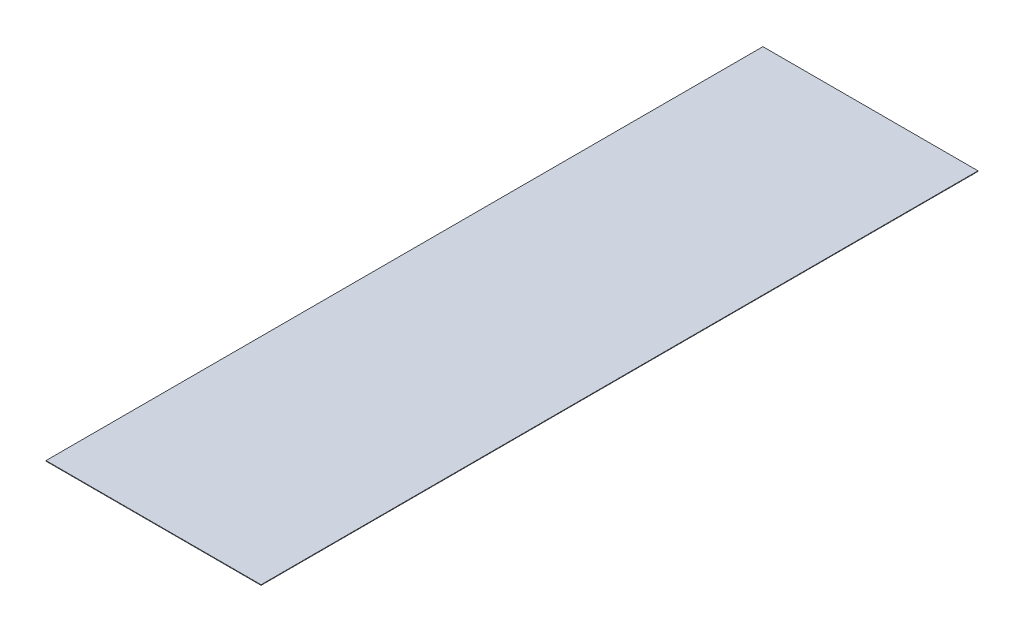
ISO-10303-21;
HEADER;
FILE_DESCRIPTION(('STEP AP214'),'2;1');
FILE_NAME('part.step','',(''),(''),'','','');
FILE_SCHEMA(('AUTOMOTIVE_DESIGN { 1 0 10303 214 1 1 1 1 }'));
ENDSEC;
DATA;
#1=APPLICATION_CONTEXT('core data for automotive mechanical design processes');
#2=APPLICATION_PROTOCOL_DEFINITION('international standard','automotive_design',2000,#1);
#3=PRODUCT_CONTEXT('',#1,'mechanical');
#4=PRODUCT('Part','Part','',(#3));
#5=PRODUCT_RELATED_PRODUCT_CATEGORY('part','',(#4));
#6=PRODUCT_DEFINITION_FORMATION('','',#4);
#7=PRODUCT_DEFINITION_CONTEXT('part definition',#1,'design');
#8=PRODUCT_DEFINITION('design','',#6,#7);
#9=PRODUCT_DEFINITION_SHAPE('','',#8);
#10=(LENGTH_UNIT() NAMED_UNIT(*) SI_UNIT(.MILLI.,.METRE.));
#11=(NAMED_UNIT(*) PLANE_ANGLE_UNIT() SI_UNIT($,.RADIAN.));
#12=(NAMED_UNIT(*) SI_UNIT($,.STERADIAN.) SOLID_ANGLE_UNIT());
#13=UNCERTAINTY_MEASURE_WITH_UNIT(LENGTH_MEASURE(1.E-05),#10,'distance_accuracy_value','');
#14=(GEOMETRIC_REPRESENTATION_CONTEXT(3) GLOBAL_UNCERTAINTY_ASSIGNED_CONTEXT((#13)) GLOBAL_UNIT_ASSIGNED_CONTEXT((#10,
#11,#12)) REPRESENTATION_CONTEXT('',''));
#15=CARTESIAN_POINT('',(0.,0.,0.));
#16=DIRECTION('',(0.,0.,1.));
#17=DIRECTION('',(1.,0.,0.));
#18=AXIS2_PLACEMENT_3D('',#15,#16,#17);
#19=CARTESIAN_POINT('',(457.2,2.3,1524.));
#20=DIRECTION('',(-1.,0.,0.));
#21=DIRECTION('',(0.,0.,1.));
#22=AXIS2_PLACEMENT_3D('',#19,#20,#21);
#23=PLANE('',#22);
#24=DIRECTION('',(0.,0.,-1.));
#25=VECTOR('',#24,1.);
#26=CARTESIAN_POINT('',(457.2,0.,1524.));
#27=LINE('',#26,#25);
#28=CARTESIAN_POINT('',(457.2,0.,1524.));
#29=VERTEX_POINT('',#28);
#30=CARTESIAN_POINT('',(457.2,0.,-1524.));
#31=VERTEX_POINT('',#30);
#32=EDGE_CURVE('E96',#29,#31,#27,.T.);
#33=ORIENTED_EDGE('',*,*,#32,.T.);
#34=DIRECTION('',(0.,-1.,0.));
#35=VECTOR('',#34,1.);
#36=CARTESIAN_POINT('',(457.2,2.3,-1524.));
#37=LINE('',#36,#35);
#38=CARTESIAN_POINT('',(457.2,2.3,-1524.));
#39=VERTEX_POINT('',#38);
#40=EDGE_CURVE('E11',#39,#31,#37,.T.);
#41=ORIENTED_EDGE('',*,*,#40,.F.);
#42=DIRECTION('',(0.,0.,-1.));
#43=VECTOR('',#42,1.);
#44=CARTESIAN_POINT('',(457.2,2.3,1524.));
#45=LINE('',#44,#43);
#46=CARTESIAN_POINT('',(457.2,2.3,1524.));
#47=VERTEX_POINT('',#46);
#48=EDGE_CURVE('E84',#47,#39,#45,.T.);
#49=ORIENTED_EDGE('',*,*,#48,.F.);
#50=DIRECTION('',(0.,-1.,0.));
#51=VECTOR('',#50,1.);
#52=CARTESIAN_POINT('',(457.2,2.3,1524.));
#53=LINE('',#52,#51);
#54=EDGE_CURVE('E92',#47,#29,#53,.T.);
#55=ORIENTED_EDGE('',*,*,#54,.T.);
#56=EDGE_LOOP('',(#33,#41,#49,#55));
#57=FACE_BOUND('',#56,.T.);
#58=ADVANCED_FACE('F33',(#57),#23,.F.);
#59=CARTESIAN_POINT('',(-457.2,2.3,-1524.));
#60=DIRECTION('',(0.,0.,1.));
#61=DIRECTION('',(1.,0.,0.));
#62=AXIS2_PLACEMENT_3D('',#59,#60,#61);
#63=PLANE('',#62);
#64=DIRECTION('',(-1.,0.,0.));
#65=VECTOR('',#64,1.);
#66=CARTESIAN_POINT('',(-457.2,0.,-1524.));
#67=LINE('',#66,#65);
#68=CARTESIAN_POINT('',(-457.2,0.,-1524.));
#69=VERTEX_POINT('',#68);
#70=EDGE_CURVE('E88',#31,#69,#67,.T.);
#71=ORIENTED_EDGE('',*,*,#70,.T.);
#72=DIRECTION('',(0.,-1.,0.));
#73=VECTOR('',#72,1.);
#74=CARTESIAN_POINT('',(-457.2,2.3,-1524.));
#75=LINE('',#74,#73);
#76=CARTESIAN_POINT('',(-457.2,2.3,-1524.));
#77=VERTEX_POINT('',#76);
#78=EDGE_CURVE('E41',#77,#69,#75,.T.);
#79=ORIENTED_EDGE('',*,*,#78,.F.);
#80=DIRECTION('',(-1.,0.,0.));
#81=VECTOR('',#80,1.);
#82=CARTESIAN_POINT('',(-457.2,2.3,-1524.));
#83=LINE('',#82,#81);
#84=EDGE_CURVE('E79',#39,#77,#83,.T.);
#85=ORIENTED_EDGE('',*,*,#84,.F.);
#86=ORIENTED_EDGE('',*,*,#40,.T.);
#87=EDGE_LOOP('',(#71,#79,#85,#86));
#88=FACE_BOUND('',#87,.T.);
#89=ADVANCED_FACE('F87',(#88),#63,.F.);
#90=CARTESIAN_POINT('',(-457.2,2.3,1524.));
#91=DIRECTION('',(1.,0.,0.));
#92=DIRECTION('',(0.,0.,-1.));
#93=AXIS2_PLACEMENT_3D('',#90,#91,#92);
#94=PLANE('',#93);
#95=DIRECTION('',(0.,0.,1.));
#96=VECTOR('',#95,1.);
#97=CARTESIAN_POINT('',(-457.2,0.,1524.));
#98=LINE('',#97,#96);
#99=CARTESIAN_POINT('',(-457.2,0.,1524.));
#100=VERTEX_POINT('',#99);
#101=EDGE_CURVE('E66',#69,#100,#98,.T.);
#102=ORIENTED_EDGE('',*,*,#101,.T.);
#103=DIRECTION('',(0.,-1.,0.));
#104=VECTOR('',#103,1.);
#105=CARTESIAN_POINT('',(-457.2,2.3,1524.));
#106=LINE('',#105,#104);
#107=CARTESIAN_POINT('',(-457.2,2.3,1524.));
#108=VERTEX_POINT('',#107);
#109=EDGE_CURVE('E89',#108,#100,#106,.T.);
#110=ORIENTED_EDGE('',*,*,#109,.F.);
#111=DIRECTION('',(0.,0.,1.));
#112=VECTOR('',#111,1.);
#113=CARTESIAN_POINT('',(-457.2,2.3,1524.));
#114=LINE('',#113,#112);
#115=EDGE_CURVE('E82',#77,#108,#114,.T.);
#116=ORIENTED_EDGE('',*,*,#115,.F.);
#117=ORIENTED_EDGE('',*,*,#78,.T.);
#118=EDGE_LOOP('',(#102,#110,#116,#117));
#119=FACE_BOUND('',#118,.T.);
#120=ADVANCED_FACE('F90',(#119),#94,.F.);
#121=CARTESIAN_POINT('',(-457.2,2.3,1524.));
#122=DIRECTION('',(0.,0.,-1.));
#123=DIRECTION('',(-1.,0.,0.));
#124=AXIS2_PLACEMENT_3D('',#121,#122,#123);
#125=PLANE('',#124);
#126=DIRECTION('',(1.,0.,0.));
#127=VECTOR('',#126,1.);
#128=CARTESIAN_POINT('',(-457.2,0.,1524.));
#129=LINE('',#128,#127);
#130=EDGE_CURVE('E72',#100,#29,#129,.T.);
#131=ORIENTED_EDGE('',*,*,#130,.T.);
#132=ORIENTED_EDGE('',*,*,#54,.F.);
#133=DIRECTION('',(1.,0.,0.));
#134=VECTOR('',#133,1.);
#135=CARTESIAN_POINT('',(-457.2,2.3,1524.));
#136=LINE('',#135,#134);
#137=EDGE_CURVE('E49',#108,#47,#136,.T.);
#138=ORIENTED_EDGE('',*,*,#137,.F.);
#139=ORIENTED_EDGE('',*,*,#109,.T.);
#140=EDGE_LOOP('',(#131,#132,#138,#139));
#141=FACE_BOUND('',#140,.T.);
#142=ADVANCED_FACE('F103',(#141),#125,.F.);
#143=CARTESIAN_POINT('',(0.,2.3,0.));
#144=DIRECTION('',(0.,-1.,0.));
#145=DIRECTION('',(0.,0.,-1.));
#146=AXIS2_PLACEMENT_3D('',#143,#144,#145);
#147=PLANE('',#146);
#148=ORIENTED_EDGE('',*,*,#48,.T.);
#149=ORIENTED_EDGE('',*,*,#84,.T.);
#150=ORIENTED_EDGE('',*,*,#115,.T.);
#151=ORIENTED_EDGE('',*,*,#137,.T.);
#152=EDGE_LOOP('',(#148,#149,#150,#151));
#153=FACE_BOUND('',#152,.T.);
#154=ADVANCED_FACE('F80',(#153),#147,.F.);
#155=CARTESIAN_POINT('',(0.,0.,0.));
#156=DIRECTION('',(0.,-1.,0.));
#157=DIRECTION('',(0.,0.,-1.));
#158=AXIS2_PLACEMENT_3D('',#155,#156,#157);
#159=PLANE('',#158);
#160=ORIENTED_EDGE('',*,*,#32,.F.);
#161=ORIENTED_EDGE('',*,*,#130,.F.);
#162=ORIENTED_EDGE('',*,*,#101,.F.);
#163=ORIENTED_EDGE('',*,*,#70,.F.);
#164=EDGE_LOOP('',(#160,#161,#162,#163));
#165=FACE_BOUND('',#164,.T.);
#166=ADVANCED_FACE('F106',(#165),#159,.T.);
#167=CLOSED_SHELL('',(#58,#89,#120,#142,#154,#166));
#168=MANIFOLD_SOLID_BREP('B2',#167);
#169=ADVANCED_BREP_SHAPE_REPRESENTATION('',(#18,#168),#14);
#170=SHAPE_DEFINITION_REPRESENTATION(#9,#169);
ENDSEC;
END-ISO-10303-21;
